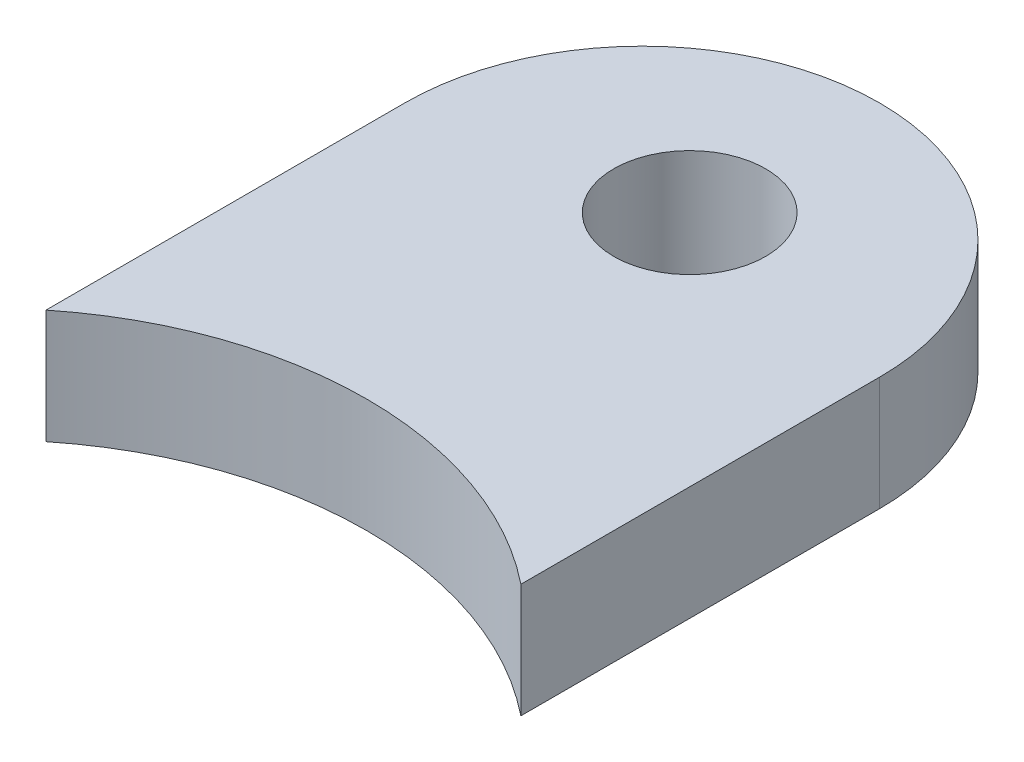
ISO-10303-21;
HEADER;
FILE_DESCRIPTION(('STEP AP214'),'2;1');
FILE_NAME('part.step','',(''),(''),'','','');
FILE_SCHEMA(('AUTOMOTIVE_DESIGN { 1 0 10303 214 1 1 1 1 }'));
ENDSEC;
DATA;
#1=APPLICATION_CONTEXT('core data for automotive mechanical design processes');
#2=APPLICATION_PROTOCOL_DEFINITION('international standard','automotive_design',2000,#1);
#3=PRODUCT_CONTEXT('',#1,'mechanical');
#4=PRODUCT('Part','Part','',(#3));
#5=PRODUCT_RELATED_PRODUCT_CATEGORY('part','',(#4));
#6=PRODUCT_DEFINITION_FORMATION('','',#4);
#7=PRODUCT_DEFINITION_CONTEXT('part definition',#1,'design');
#8=PRODUCT_DEFINITION('design','',#6,#7);
#9=PRODUCT_DEFINITION_SHAPE('','',#8);
#10=(LENGTH_UNIT() NAMED_UNIT(*) SI_UNIT(.MILLI.,.METRE.));
#11=(NAMED_UNIT(*) PLANE_ANGLE_UNIT() SI_UNIT($,.RADIAN.));
#12=(NAMED_UNIT(*) SI_UNIT($,.STERADIAN.) SOLID_ANGLE_UNIT());
#13=UNCERTAINTY_MEASURE_WITH_UNIT(LENGTH_MEASURE(1.E-05),#10,'distance_accuracy_value','');
#14=(GEOMETRIC_REPRESENTATION_CONTEXT(3) GLOBAL_UNCERTAINTY_ASSIGNED_CONTEXT((#13)) GLOBAL_UNIT_ASSIGNED_CONTEXT((#10,
#11,#12)) REPRESENTATION_CONTEXT('',''));
#15=CARTESIAN_POINT('',(0.,0.,0.));
#16=DIRECTION('',(0.,0.,1.));
#17=DIRECTION('',(1.,0.,0.));
#18=AXIS2_PLACEMENT_3D('',#15,#16,#17);
#19=CARTESIAN_POINT('',(0.,6.,0.));
#20=DIRECTION('',(0.,-1.,0.));
#21=DIRECTION('',(0.,0.,-1.));
#22=AXIS2_PLACEMENT_3D('',#19,#20,#21);
#23=PLANE('',#22);
#24=DIRECTION('',(0.,0.,1.));
#25=VECTOR('',#24,1.);
#26=CARTESIAN_POINT('',(0.,6.,0.));
#27=LINE('',#26,#25);
#28=CARTESIAN_POINT('',(0.,6.,-22.5));
#29=VERTEX_POINT('',#28);
#30=CARTESIAN_POINT('',(0.,6.,-3.61249499599598));
#31=VERTEX_POINT('',#30);
#32=EDGE_CURVE('E101',#29,#31,#27,.T.);
#33=ORIENTED_EDGE('',*,*,#32,.T.);
#34=CARTESIAN_POINT('',(12.5,6.,12.));
#35=DIRECTION('',(0.,1.,0.));
#36=DIRECTION('',(0.,0.,1.));
#37=AXIS2_PLACEMENT_3D('',#34,#35,#36);
#38=CIRCLE('',#37,20.);
#39=CARTESIAN_POINT('',(25.,6.,-3.61249499599598));
#40=VERTEX_POINT('',#39);
#41=EDGE_CURVE('E92',#40,#31,#38,.T.);
#42=ORIENTED_EDGE('',*,*,#41,.F.);
#43=DIRECTION('',(0.,0.,-1.));
#44=VECTOR('',#43,1.);
#45=CARTESIAN_POINT('',(25.,6.,0.));
#46=LINE('',#45,#44);
#47=CARTESIAN_POINT('',(25.,6.,-22.5));
#48=VERTEX_POINT('',#47);
#49=EDGE_CURVE('E99',#40,#48,#46,.T.);
#50=ORIENTED_EDGE('',*,*,#49,.T.);
#51=CARTESIAN_POINT('',(12.5,6.,-22.5));
#52=DIRECTION('',(0.,-1.,0.));
#53=DIRECTION('',(0.,0.,-1.));
#54=AXIS2_PLACEMENT_3D('',#51,#52,#53);
#55=CIRCLE('',#54,12.5);
#56=CARTESIAN_POINT('',(12.5,6.,-35.));
#57=VERTEX_POINT('',#56);
#58=EDGE_CURVE('E69',#48,#57,#55,.F.);
#59=ORIENTED_EDGE('',*,*,#58,.T.);
#60=CARTESIAN_POINT('',(12.5,6.,-22.5));
#61=DIRECTION('',(0.,-1.,0.));
#62=DIRECTION('',(0.,0.,-1.));
#63=AXIS2_PLACEMENT_3D('',#60,#61,#62);
#64=CIRCLE('',#63,12.5);
#65=EDGE_CURVE('E123',#57,#29,#64,.F.);
#66=ORIENTED_EDGE('',*,*,#65,.T.);
#67=EDGE_LOOP('',(#33,#42,#50,#59,#66));
#68=FACE_BOUND('',#67,.T.);
#69=CARTESIAN_POINT('',(12.5,6.,-25.));
#70=DIRECTION('',(0.,1.,0.));
#71=DIRECTION('',(0.,0.,1.));
#72=AXIS2_PLACEMENT_3D('',#69,#70,#71);
#73=CIRCLE('',#72,4.);
#74=CARTESIAN_POINT('',(12.5,6.,-21.));
#75=VERTEX_POINT('',#74);
#76=EDGE_CURVE('E118',#75,#75,#73,.T.);
#77=ORIENTED_EDGE('',*,*,#76,.F.);
#78=EDGE_LOOP('',(#77));
#79=FACE_BOUND('',#78,.T.);
#80=ADVANCED_FACE('F47',(#68,#79),#23,.F.);
#81=CARTESIAN_POINT('',(0.,0.,0.));
#82=DIRECTION('',(0.,-1.,0.));
#83=DIRECTION('',(0.,0.,-1.));
#84=AXIS2_PLACEMENT_3D('',#81,#82,#83);
#85=PLANE('',#84);
#86=CARTESIAN_POINT('',(12.5,0.,12.));
#87=DIRECTION('',(0.,1.,0.));
#88=DIRECTION('',(0.,0.,1.));
#89=AXIS2_PLACEMENT_3D('',#86,#87,#88);
#90=CIRCLE('',#89,20.);
#91=CARTESIAN_POINT('',(25.,0.,-3.61249499599598));
#92=VERTEX_POINT('',#91);
#93=CARTESIAN_POINT('',(0.,0.,-3.61249499599598));
#94=VERTEX_POINT('',#93);
#95=EDGE_CURVE('E62',#92,#94,#90,.T.);
#96=ORIENTED_EDGE('',*,*,#95,.T.);
#97=DIRECTION('',(0.,0.,1.));
#98=VECTOR('',#97,1.);
#99=CARTESIAN_POINT('',(0.,0.,0.));
#100=LINE('',#99,#98);
#101=CARTESIAN_POINT('',(0.,0.,-22.5));
#102=VERTEX_POINT('',#101);
#103=EDGE_CURVE('E115',#102,#94,#100,.T.);
#104=ORIENTED_EDGE('',*,*,#103,.F.);
#105=CARTESIAN_POINT('',(12.5,0.,-22.5));
#106=DIRECTION('',(0.,-1.,0.));
#107=DIRECTION('',(0.,0.,-1.));
#108=AXIS2_PLACEMENT_3D('',#105,#106,#107);
#109=CIRCLE('',#108,12.5);
#110=CARTESIAN_POINT('',(12.5,0.,-35.));
#111=VERTEX_POINT('',#110);
#112=EDGE_CURVE('E107',#102,#111,#109,.T.);
#113=ORIENTED_EDGE('',*,*,#112,.T.);
#114=CARTESIAN_POINT('',(12.5,0.,-22.5));
#115=DIRECTION('',(0.,-1.,0.));
#116=DIRECTION('',(0.,0.,-1.));
#117=AXIS2_PLACEMENT_3D('',#114,#115,#116);
#118=CIRCLE('',#117,12.5);
#119=CARTESIAN_POINT('',(25.,0.,-22.5));
#120=VERTEX_POINT('',#119);
#121=EDGE_CURVE('E109',#111,#120,#118,.T.);
#122=ORIENTED_EDGE('',*,*,#121,.T.);
#123=DIRECTION('',(0.,0.,-1.));
#124=VECTOR('',#123,1.);
#125=CARTESIAN_POINT('',(25.,0.,0.));
#126=LINE('',#125,#124);
#127=EDGE_CURVE('E111',#92,#120,#126,.T.);
#128=ORIENTED_EDGE('',*,*,#127,.F.);
#129=EDGE_LOOP('',(#96,#104,#113,#122,#128));
#130=FACE_BOUND('',#129,.T.);
#131=CARTESIAN_POINT('',(12.5,0.,-25.));
#132=DIRECTION('',(0.,1.,0.));
#133=DIRECTION('',(0.,0.,1.));
#134=AXIS2_PLACEMENT_3D('',#131,#132,#133);
#135=CIRCLE('',#134,4.);
#136=CARTESIAN_POINT('',(12.5,0.,-21.));
#137=VERTEX_POINT('',#136);
#138=EDGE_CURVE('E128',#137,#137,#135,.T.);
#139=ORIENTED_EDGE('',*,*,#138,.T.);
#140=EDGE_LOOP('',(#139));
#141=FACE_BOUND('',#140,.T.);
#142=ADVANCED_FACE('F144',(#130,#141),#85,.T.);
#143=CARTESIAN_POINT('',(0.,6.,0.));
#144=DIRECTION('',(1.,0.,0.));
#145=DIRECTION('',(0.,0.,-1.));
#146=AXIS2_PLACEMENT_3D('',#143,#144,#145);
#147=PLANE('',#146);
#148=ORIENTED_EDGE('',*,*,#103,.T.);
#149=DIRECTION('',(0.,1.,0.));
#150=VECTOR('',#149,1.);
#151=CARTESIAN_POINT('',(0.,0.,-3.61249499599598));
#152=LINE('',#151,#150);
#153=EDGE_CURVE('E129',#94,#31,#152,.T.);
#154=ORIENTED_EDGE('',*,*,#153,.T.);
#155=ORIENTED_EDGE('',*,*,#32,.F.);
#156=DIRECTION('',(0.,-1.,0.));
#157=VECTOR('',#156,1.);
#158=CARTESIAN_POINT('',(0.,6.,-22.5));
#159=LINE('',#158,#157);
#160=EDGE_CURVE('E55',#29,#102,#159,.T.);
#161=ORIENTED_EDGE('',*,*,#160,.T.);
#162=EDGE_LOOP('',(#148,#154,#155,#161));
#163=FACE_BOUND('',#162,.T.);
#164=ADVANCED_FACE('F149',(#163),#147,.F.);
#165=CARTESIAN_POINT('',(25.,6.,0.));
#166=DIRECTION('',(-1.,0.,0.));
#167=DIRECTION('',(0.,0.,1.));
#168=AXIS2_PLACEMENT_3D('',#165,#166,#167);
#169=PLANE('',#168);
#170=ORIENTED_EDGE('',*,*,#49,.F.);
#171=DIRECTION('',(0.,1.,0.));
#172=VECTOR('',#171,1.);
#173=CARTESIAN_POINT('',(25.,0.,-3.61249499599598));
#174=LINE('',#173,#172);
#175=EDGE_CURVE('E11',#40,#92,#174,.F.);
#176=ORIENTED_EDGE('',*,*,#175,.T.);
#177=ORIENTED_EDGE('',*,*,#127,.T.);
#178=DIRECTION('',(0.,-1.,0.));
#179=VECTOR('',#178,1.);
#180=CARTESIAN_POINT('',(25.,6.,-22.5));
#181=LINE('',#180,#179);
#182=EDGE_CURVE('E106',#120,#48,#181,.F.);
#183=ORIENTED_EDGE('',*,*,#182,.T.);
#184=EDGE_LOOP('',(#170,#176,#177,#183));
#185=FACE_BOUND('',#184,.T.);
#186=ADVANCED_FACE('F104',(#185),#169,.F.);
#187=CARTESIAN_POINT('',(12.5,6.,-25.));
#188=DIRECTION('',(0.,-1.,0.));
#189=DIRECTION('',(0.,0.,-1.));
#190=AXIS2_PLACEMENT_3D('',#187,#188,#189);
#191=CYLINDRICAL_SURFACE('',#190,4.);
#192=ORIENTED_EDGE('',*,*,#76,.T.);
#193=EDGE_LOOP('',(#192));
#194=FACE_BOUND('',#193,.T.);
#195=ORIENTED_EDGE('',*,*,#138,.F.);
#196=EDGE_LOOP('',(#195));
#197=FACE_BOUND('',#196,.T.);
#198=ADVANCED_FACE('F141',(#194,#197),#191,.F.);
#199=CARTESIAN_POINT('',(12.5,6.,-22.5));
#200=DIRECTION('',(0.,-1.,0.));
#201=DIRECTION('',(0.,0.,-1.));
#202=AXIS2_PLACEMENT_3D('',#199,#200,#201);
#203=CYLINDRICAL_SURFACE('',#202,12.5);
#204=ORIENTED_EDGE('',*,*,#160,.F.);
#205=ORIENTED_EDGE('',*,*,#65,.F.);
#206=DIRECTION('',(0.,-1.,0.));
#207=VECTOR('',#206,1.);
#208=CARTESIAN_POINT('',(12.5,6.,-35.));
#209=LINE('',#208,#207);
#210=EDGE_CURVE('E126',#111,#57,#209,.F.);
#211=ORIENTED_EDGE('',*,*,#210,.F.);
#212=ORIENTED_EDGE('',*,*,#112,.F.);
#213=EDGE_LOOP('',(#204,#205,#211,#212));
#214=FACE_BOUND('',#213,.T.);
#215=ADVANCED_FACE('F49',(#214),#203,.T.);
#216=CARTESIAN_POINT('',(12.5,6.,-22.5));
#217=DIRECTION('',(0.,-1.,0.));
#218=DIRECTION('',(0.,0.,-1.));
#219=AXIS2_PLACEMENT_3D('',#216,#217,#218);
#220=CYLINDRICAL_SURFACE('',#219,12.5);
#221=ORIENTED_EDGE('',*,*,#58,.F.);
#222=ORIENTED_EDGE('',*,*,#182,.F.);
#223=ORIENTED_EDGE('',*,*,#121,.F.);
#224=ORIENTED_EDGE('',*,*,#210,.T.);
#225=EDGE_LOOP('',(#221,#222,#223,#224));
#226=FACE_BOUND('',#225,.T.);
#227=ADVANCED_FACE('F158',(#226),#220,.T.);
#228=CARTESIAN_POINT('',(12.5,0.,12.));
#229=DIRECTION('',(0.,1.,0.));
#230=DIRECTION('',(0.,0.,1.));
#231=AXIS2_PLACEMENT_3D('',#228,#229,#230);
#232=CYLINDRICAL_SURFACE('',#231,20.);
#233=ORIENTED_EDGE('',*,*,#95,.F.);
#234=ORIENTED_EDGE('',*,*,#175,.F.);
#235=ORIENTED_EDGE('',*,*,#41,.T.);
#236=ORIENTED_EDGE('',*,*,#153,.F.);
#237=EDGE_LOOP('',(#233,#234,#235,#236));
#238=FACE_BOUND('',#237,.T.);
#239=ADVANCED_FACE('F91',(#238),#232,.F.);
#240=CLOSED_SHELL('',(#80,#142,#164,#186,#198,#215,#227,#239));
#241=MANIFOLD_SOLID_BREP('B2',#240);
#242=ADVANCED_BREP_SHAPE_REPRESENTATION('',(#18,#241),#14);
#243=SHAPE_DEFINITION_REPRESENTATION(#9,#242);
ENDSEC;
END-ISO-10303-21;
